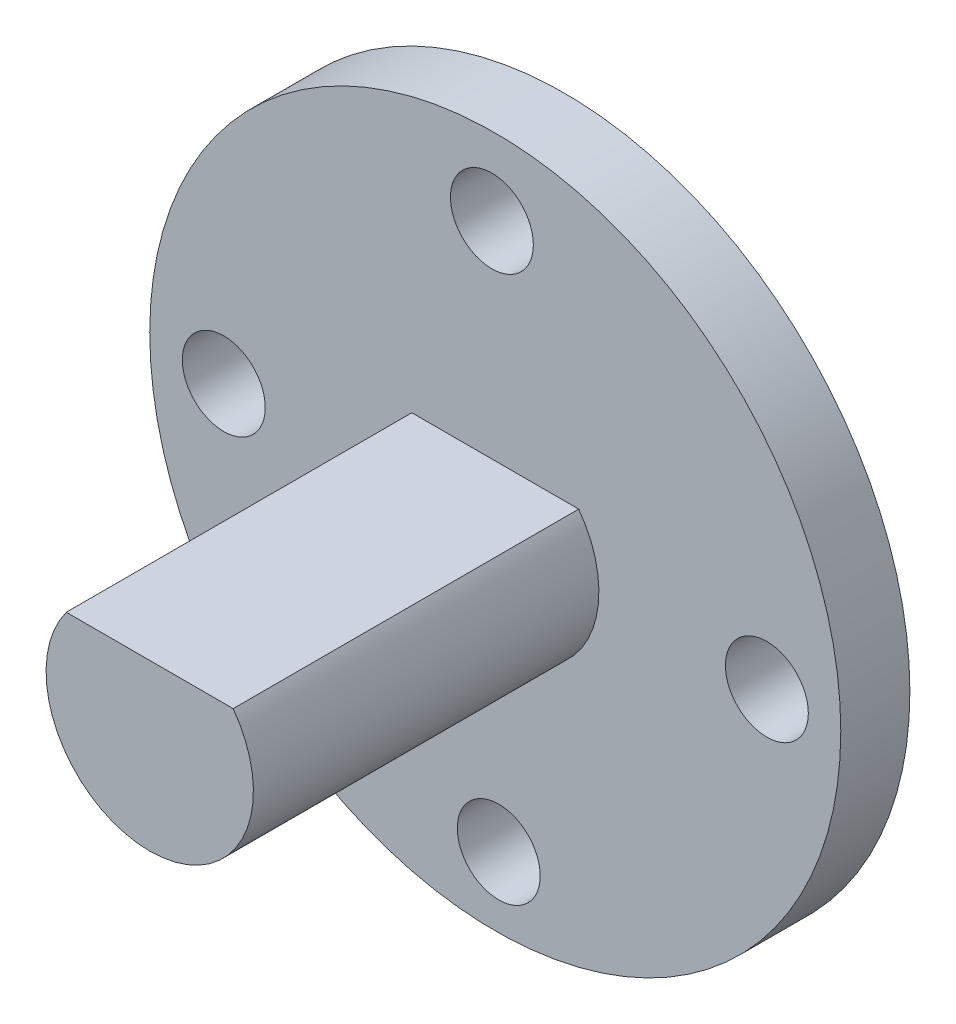
ISO-10303-21;
HEADER;
FILE_DESCRIPTION(('STEP AP214'),'2;1');
FILE_NAME('part.step','',(''),(''),'','','');
FILE_SCHEMA(('AUTOMOTIVE_DESIGN { 1 0 10303 214 1 1 1 1 }'));
ENDSEC;
DATA;
#1=APPLICATION_CONTEXT('core data for automotive mechanical design processes');
#2=APPLICATION_PROTOCOL_DEFINITION('international standard','automotive_design',2000,#1);
#3=PRODUCT_CONTEXT('',#1,'mechanical');
#4=PRODUCT('Part','Part','',(#3));
#5=PRODUCT_RELATED_PRODUCT_CATEGORY('part','',(#4));
#6=PRODUCT_DEFINITION_FORMATION('','',#4);
#7=PRODUCT_DEFINITION_CONTEXT('part definition',#1,'design');
#8=PRODUCT_DEFINITION('design','',#6,#7);
#9=PRODUCT_DEFINITION_SHAPE('','',#8);
#10=(LENGTH_UNIT() NAMED_UNIT(*) SI_UNIT(.MILLI.,.METRE.));
#11=(NAMED_UNIT(*) PLANE_ANGLE_UNIT() SI_UNIT($,.RADIAN.));
#12=(NAMED_UNIT(*) SI_UNIT($,.STERADIAN.) SOLID_ANGLE_UNIT());
#13=UNCERTAINTY_MEASURE_WITH_UNIT(LENGTH_MEASURE(1.E-05),#10,'distance_accuracy_value','');
#14=(GEOMETRIC_REPRESENTATION_CONTEXT(3) GLOBAL_UNCERTAINTY_ASSIGNED_CONTEXT((#13)) GLOBAL_UNIT_ASSIGNED_CONTEXT((#10,
#11,#12)) REPRESENTATION_CONTEXT('',''));
#15=CARTESIAN_POINT('',(0.,0.,0.));
#16=DIRECTION('',(0.,0.,1.));
#17=DIRECTION('',(1.,0.,0.));
#18=AXIS2_PLACEMENT_3D('',#15,#16,#17);
#19=CARTESIAN_POINT('',(0.,0.,2.));
#20=DIRECTION('',(0.,0.,-1.));
#21=DIRECTION('',(-1.,0.,0.));
#22=AXIS2_PLACEMENT_3D('',#19,#20,#21);
#23=CYLINDRICAL_SURFACE('',#22,10.);
#24=CARTESIAN_POINT('',(0.,0.,2.));
#25=DIRECTION('',(0.,0.,1.));
#26=DIRECTION('',(1.,0.,0.));
#27=AXIS2_PLACEMENT_3D('',#24,#25,#26);
#28=CIRCLE('',#27,10.);
#29=CARTESIAN_POINT('',(10.,0.,2.));
#30=VERTEX_POINT('',#29);
#31=EDGE_CURVE('E40',#30,#30,#28,.T.);
#32=ORIENTED_EDGE('',*,*,#31,.F.);
#33=EDGE_LOOP('',(#32));
#34=FACE_BOUND('',#33,.T.);
#35=CARTESIAN_POINT('',(0.,0.,0.));
#36=DIRECTION('',(0.,0.,1.));
#37=DIRECTION('',(1.,0.,0.));
#38=AXIS2_PLACEMENT_3D('',#35,#36,#37);
#39=CIRCLE('',#38,10.);
#40=CARTESIAN_POINT('',(10.,0.,0.));
#41=VERTEX_POINT('',#40);
#42=EDGE_CURVE('E99',#41,#41,#39,.T.);
#43=ORIENTED_EDGE('',*,*,#42,.T.);
#44=EDGE_LOOP('',(#43));
#45=FACE_BOUND('',#44,.T.);
#46=ADVANCED_FACE('F33',(#34,#45),#23,.T.);
#47=CARTESIAN_POINT('',(0.,0.,2.));
#48=DIRECTION('',(0.,0.,1.));
#49=DIRECTION('',(1.,0.,0.));
#50=AXIS2_PLACEMENT_3D('',#47,#48,#49);
#51=PLANE('',#50);
#52=CARTESIAN_POINT('',(0.,0.,2.));
#53=DIRECTION('',(0.,0.,1.));
#54=DIRECTION('',(1.,0.,0.));
#55=AXIS2_PLACEMENT_3D('',#52,#53,#54);
#56=CIRCLE('',#55,3.);
#57=CARTESIAN_POINT('',(-2.41487059694717,1.78,2.));
#58=VERTEX_POINT('',#57);
#59=CARTESIAN_POINT('',(2.41487059694717,1.78,2.));
#60=VERTEX_POINT('',#59);
#61=EDGE_CURVE('E67',#58,#60,#56,.T.);
#62=ORIENTED_EDGE('',*,*,#61,.F.);
#63=DIRECTION('',(-1.,0.,0.));
#64=VECTOR('',#63,1.);
#65=CARTESIAN_POINT('',(-3.,1.78,2.));
#66=LINE('',#65,#64);
#67=EDGE_CURVE('E57',#60,#58,#66,.T.);
#68=ORIENTED_EDGE('',*,*,#67,.F.);
#69=EDGE_LOOP('',(#62,#68));
#70=FACE_BOUND('',#69,.T.);
#71=CARTESIAN_POINT('',(7.85994115864726,-0.013687731646682,2.));
#72=DIRECTION('',(0.,0.,1.));
#73=DIRECTION('',(1.,0.,0.));
#74=AXIS2_PLACEMENT_3D('',#71,#72,#73);
#75=CIRCLE('',#74,1.2);
#76=CARTESIAN_POINT('',(9.05994115864726,-0.013687731646682,2.));
#77=VERTEX_POINT('',#76);
#78=EDGE_CURVE('E72',#77,#77,#75,.T.);
#79=ORIENTED_EDGE('',*,*,#78,.F.);
#80=EDGE_LOOP('',(#79));
#81=FACE_BOUND('',#80,.T.);
#82=CARTESIAN_POINT('',(0.100907230977283,-7.97167124720571,2.));
#83=DIRECTION('',(0.,0.,1.));
#84=DIRECTION('',(1.,0.,0.));
#85=AXIS2_PLACEMENT_3D('',#82,#83,#84);
#86=CIRCLE('',#85,1.2);
#87=CARTESIAN_POINT('',(1.30090723097728,-7.97167124720571,2.));
#88=VERTEX_POINT('',#87);
#89=EDGE_CURVE('E81',#88,#88,#86,.T.);
#90=ORIENTED_EDGE('',*,*,#89,.F.);
#91=EDGE_LOOP('',(#90));
#92=FACE_BOUND('',#91,.T.);
#93=CARTESIAN_POINT('',(-7.85707628458166,-0.212637319535759,2.));
#94=DIRECTION('',(0.,0.,1.));
#95=DIRECTION('',(1.,0.,0.));
#96=AXIS2_PLACEMENT_3D('',#93,#94,#95);
#97=CIRCLE('',#96,1.2);
#98=CARTESIAN_POINT('',(-6.65707628458166,-0.212637319535759,2.));
#99=VERTEX_POINT('',#98);
#100=EDGE_CURVE('E87',#99,#99,#97,.T.);
#101=ORIENTED_EDGE('',*,*,#100,.F.);
#102=EDGE_LOOP('',(#101));
#103=FACE_BOUND('',#102,.T.);
#104=CARTESIAN_POINT('',(-0.0980423569116846,7.74534619602321,2.));
#105=DIRECTION('',(0.,0.,1.));
#106=DIRECTION('',(1.,0.,0.));
#107=AXIS2_PLACEMENT_3D('',#104,#105,#106);
#108=CIRCLE('',#107,1.2);
#109=CARTESIAN_POINT('',(1.10195764308831,7.74534619602321,2.));
#110=VERTEX_POINT('',#109);
#111=EDGE_CURVE('E93',#110,#110,#108,.T.);
#112=ORIENTED_EDGE('',*,*,#111,.F.);
#113=EDGE_LOOP('',(#112));
#114=FACE_BOUND('',#113,.T.);
#115=ORIENTED_EDGE('',*,*,#31,.T.);
#116=EDGE_LOOP('',(#115));
#117=FACE_BOUND('',#116,.T.);
#118=ADVANCED_FACE('F65',(#70,#81,#92,#103,#114,#117),#51,.T.);
#119=CARTESIAN_POINT('',(0.,0.,0.));
#120=DIRECTION('',(0.,0.,1.));
#121=DIRECTION('',(1.,0.,0.));
#122=AXIS2_PLACEMENT_3D('',#119,#120,#121);
#123=PLANE('',#122);
#124=CARTESIAN_POINT('',(7.85994115864726,-0.013687731646682,0.));
#125=DIRECTION('',(0.,0.,1.));
#126=DIRECTION('',(1.,0.,0.));
#127=AXIS2_PLACEMENT_3D('',#124,#125,#126);
#128=CIRCLE('',#127,1.2);
#129=CARTESIAN_POINT('',(9.05994115864726,-0.013687731646682,0.));
#130=VERTEX_POINT('',#129);
#131=EDGE_CURVE('E78',#130,#130,#128,.T.);
#132=ORIENTED_EDGE('',*,*,#131,.T.);
#133=EDGE_LOOP('',(#132));
#134=FACE_BOUND('',#133,.T.);
#135=CARTESIAN_POINT('',(0.100907230977283,-7.97167124720571,0.));
#136=DIRECTION('',(0.,0.,1.));
#137=DIRECTION('',(1.,0.,0.));
#138=AXIS2_PLACEMENT_3D('',#135,#136,#137);
#139=CIRCLE('',#138,1.2);
#140=CARTESIAN_POINT('',(1.30090723097728,-7.97167124720571,0.));
#141=VERTEX_POINT('',#140);
#142=EDGE_CURVE('E84',#141,#141,#139,.T.);
#143=ORIENTED_EDGE('',*,*,#142,.T.);
#144=EDGE_LOOP('',(#143));
#145=FACE_BOUND('',#144,.T.);
#146=CARTESIAN_POINT('',(-7.85707628458166,-0.212637319535759,0.));
#147=DIRECTION('',(0.,0.,1.));
#148=DIRECTION('',(1.,0.,0.));
#149=AXIS2_PLACEMENT_3D('',#146,#147,#148);
#150=CIRCLE('',#149,1.2);
#151=CARTESIAN_POINT('',(-6.65707628458166,-0.212637319535759,0.));
#152=VERTEX_POINT('',#151);
#153=EDGE_CURVE('E90',#152,#152,#150,.T.);
#154=ORIENTED_EDGE('',*,*,#153,.T.);
#155=EDGE_LOOP('',(#154));
#156=FACE_BOUND('',#155,.T.);
#157=CARTESIAN_POINT('',(-0.0980423569116846,7.74534619602321,0.));
#158=DIRECTION('',(0.,0.,1.));
#159=DIRECTION('',(1.,0.,0.));
#160=AXIS2_PLACEMENT_3D('',#157,#158,#159);
#161=CIRCLE('',#160,1.2);
#162=CARTESIAN_POINT('',(1.10195764308831,7.74534619602321,0.));
#163=VERTEX_POINT('',#162);
#164=EDGE_CURVE('E96',#163,#163,#161,.T.);
#165=ORIENTED_EDGE('',*,*,#164,.T.);
#166=EDGE_LOOP('',(#165));
#167=FACE_BOUND('',#166,.T.);
#168=ORIENTED_EDGE('',*,*,#42,.F.);
#169=EDGE_LOOP('',(#168));
#170=FACE_BOUND('',#169,.T.);
#171=ADVANCED_FACE('F105',(#134,#145,#156,#167,#170),#123,.F.);
#172=CARTESIAN_POINT('',(-0.0980423569116846,7.74534619602321,2.));
#173=DIRECTION('',(0.,0.,1.));
#174=DIRECTION('',(1.,0.,0.));
#175=AXIS2_PLACEMENT_3D('',#172,#173,#174);
#176=CYLINDRICAL_SURFACE('',#175,1.2);
#177=ORIENTED_EDGE('',*,*,#164,.F.);
#178=EDGE_LOOP('',(#177));
#179=FACE_BOUND('',#178,.T.);
#180=ORIENTED_EDGE('',*,*,#111,.T.);
#181=EDGE_LOOP('',(#180));
#182=FACE_BOUND('',#181,.T.);
#183=ADVANCED_FACE('F107',(#179,#182),#176,.F.);
#184=CARTESIAN_POINT('',(-7.85707628458166,-0.212637319535759,2.));
#185=DIRECTION('',(0.,0.,1.));
#186=DIRECTION('',(1.,0.,0.));
#187=AXIS2_PLACEMENT_3D('',#184,#185,#186);
#188=CYLINDRICAL_SURFACE('',#187,1.2);
#189=ORIENTED_EDGE('',*,*,#153,.F.);
#190=EDGE_LOOP('',(#189));
#191=FACE_BOUND('',#190,.T.);
#192=ORIENTED_EDGE('',*,*,#100,.T.);
#193=EDGE_LOOP('',(#192));
#194=FACE_BOUND('',#193,.T.);
#195=ADVANCED_FACE('F113',(#191,#194),#188,.F.);
#196=CARTESIAN_POINT('',(0.100907230977283,-7.97167124720571,2.));
#197=DIRECTION('',(0.,0.,1.));
#198=DIRECTION('',(1.,0.,0.));
#199=AXIS2_PLACEMENT_3D('',#196,#197,#198);
#200=CYLINDRICAL_SURFACE('',#199,1.2);
#201=ORIENTED_EDGE('',*,*,#142,.F.);
#202=EDGE_LOOP('',(#201));
#203=FACE_BOUND('',#202,.T.);
#204=ORIENTED_EDGE('',*,*,#89,.T.);
#205=EDGE_LOOP('',(#204));
#206=FACE_BOUND('',#205,.T.);
#207=ADVANCED_FACE('F168',(#203,#206),#200,.F.);
#208=CARTESIAN_POINT('',(7.85994115864726,-0.013687731646682,2.));
#209=DIRECTION('',(0.,0.,1.));
#210=DIRECTION('',(1.,0.,0.));
#211=AXIS2_PLACEMENT_3D('',#208,#209,#210);
#212=CYLINDRICAL_SURFACE('',#211,1.2);
#213=ORIENTED_EDGE('',*,*,#131,.F.);
#214=EDGE_LOOP('',(#213));
#215=FACE_BOUND('',#214,.T.);
#216=ORIENTED_EDGE('',*,*,#78,.T.);
#217=EDGE_LOOP('',(#216));
#218=FACE_BOUND('',#217,.T.);
#219=ADVANCED_FACE('F138',(#215,#218),#212,.F.);
#220=CARTESIAN_POINT('',(0.,0.,12.));
#221=DIRECTION('',(0.,0.,-1.));
#222=DIRECTION('',(-1.,0.,0.));
#223=AXIS2_PLACEMENT_3D('',#220,#221,#222);
#224=CYLINDRICAL_SURFACE('',#223,3.);
#225=CARTESIAN_POINT('',(0.,0.,12.));
#226=DIRECTION('',(0.,0.,1.));
#227=DIRECTION('',(1.,0.,0.));
#228=AXIS2_PLACEMENT_3D('',#225,#226,#227);
#229=CIRCLE('',#228,3.);
#230=CARTESIAN_POINT('',(-2.41487059694717,1.78,12.));
#231=VERTEX_POINT('',#230);
#232=CARTESIAN_POINT('',(2.41487059694717,1.78,12.));
#233=VERTEX_POINT('',#232);
#234=EDGE_CURVE('E70',#231,#233,#229,.T.);
#235=ORIENTED_EDGE('',*,*,#234,.F.);
#236=DIRECTION('',(0.,0.,-1.));
#237=VECTOR('',#236,1.);
#238=CARTESIAN_POINT('',(-2.41487059694717,1.78,12.));
#239=LINE('',#238,#237);
#240=EDGE_CURVE('E46',#231,#58,#239,.T.);
#241=ORIENTED_EDGE('',*,*,#240,.T.);
#242=ORIENTED_EDGE('',*,*,#61,.T.);
#243=DIRECTION('',(0.,0.,-1.));
#244=VECTOR('',#243,1.);
#245=CARTESIAN_POINT('',(2.41487059694717,1.78,12.));
#246=LINE('',#245,#244);
#247=EDGE_CURVE('E54',#60,#233,#246,.F.);
#248=ORIENTED_EDGE('',*,*,#247,.T.);
#249=EDGE_LOOP('',(#235,#241,#242,#248));
#250=FACE_BOUND('',#249,.T.);
#251=ADVANCED_FACE('F69',(#250),#224,.T.);
#252=CARTESIAN_POINT('',(0.,0.,12.));
#253=DIRECTION('',(0.,0.,1.));
#254=DIRECTION('',(1.,0.,0.));
#255=AXIS2_PLACEMENT_3D('',#252,#253,#254);
#256=PLANE('',#255);
#257=DIRECTION('',(1.,0.,0.));
#258=VECTOR('',#257,1.);
#259=CARTESIAN_POINT('',(0.,1.78,12.));
#260=LINE('',#259,#258);
#261=EDGE_CURVE('E11',#231,#233,#260,.T.);
#262=ORIENTED_EDGE('',*,*,#261,.F.);
#263=ORIENTED_EDGE('',*,*,#234,.T.);
#264=EDGE_LOOP('',(#262,#263));
#265=FACE_BOUND('',#264,.T.);
#266=ADVANCED_FACE('F147',(#265),#256,.T.);
#267=CARTESIAN_POINT('',(-3.,1.78,-4.12277714766755));
#268=DIRECTION('',(0.,-1.,0.));
#269=DIRECTION('',(0.,0.,-1.));
#270=AXIS2_PLACEMENT_3D('',#267,#268,#269);
#271=PLANE('',#270);
#272=ORIENTED_EDGE('',*,*,#261,.T.);
#273=ORIENTED_EDGE('',*,*,#247,.F.);
#274=ORIENTED_EDGE('',*,*,#67,.T.);
#275=ORIENTED_EDGE('',*,*,#240,.F.);
#276=EDGE_LOOP('',(#272,#273,#274,#275));
#277=FACE_BOUND('',#276,.T.);
#278=ADVANCED_FACE('F56',(#277),#271,.F.);
#279=CLOSED_SHELL('',(#46,#118,#171,#183,#195,#207,#219,#251,#266,#278));
#280=MANIFOLD_SOLID_BREP('B2',#279);
#281=ADVANCED_BREP_SHAPE_REPRESENTATION('',(#18,#280),#14);
#282=SHAPE_DEFINITION_REPRESENTATION(#9,#281);
ENDSEC;
END-ISO-10303-21;
